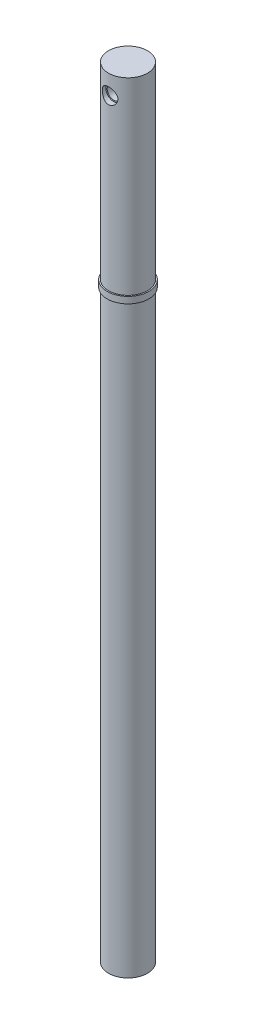
ISO-10303-21;
HEADER;
FILE_DESCRIPTION(('STEP AP214'),'2;1');
FILE_NAME('part.step','',(''),(''),'','','');
FILE_SCHEMA(('AUTOMOTIVE_DESIGN { 1 0 10303 214 1 1 1 1 }'));
ENDSEC;
DATA;
#1=APPLICATION_CONTEXT('core data for automotive mechanical design processes');
#2=APPLICATION_PROTOCOL_DEFINITION('international standard','automotive_design',2000,#1);
#3=PRODUCT_CONTEXT('',#1,'mechanical');
#4=PRODUCT('Part','Part','',(#3));
#5=PRODUCT_RELATED_PRODUCT_CATEGORY('part','',(#4));
#6=PRODUCT_DEFINITION_FORMATION('','',#4);
#7=PRODUCT_DEFINITION_CONTEXT('part definition',#1,'design');
#8=PRODUCT_DEFINITION('design','',#6,#7);
#9=PRODUCT_DEFINITION_SHAPE('','',#8);
#10=(LENGTH_UNIT() NAMED_UNIT(*) SI_UNIT(.MILLI.,.METRE.));
#11=(NAMED_UNIT(*) PLANE_ANGLE_UNIT() SI_UNIT($,.RADIAN.));
#12=(NAMED_UNIT(*) SI_UNIT($,.STERADIAN.) SOLID_ANGLE_UNIT());
#13=UNCERTAINTY_MEASURE_WITH_UNIT(LENGTH_MEASURE(1.E-05),#10,'distance_accuracy_value','');
#14=(GEOMETRIC_REPRESENTATION_CONTEXT(3) GLOBAL_UNCERTAINTY_ASSIGNED_CONTEXT((#13)) GLOBAL_UNIT_ASSIGNED_CONTEXT((#10,
#11,#12)) REPRESENTATION_CONTEXT('',''));
#15=CARTESIAN_POINT('',(0.,0.,0.));
#16=DIRECTION('',(0.,0.,1.));
#17=DIRECTION('',(1.,0.,0.));
#18=AXIS2_PLACEMENT_3D('',#15,#16,#17);
#19=CARTESIAN_POINT('',(0.,-1.5,-2.));
#20=DIRECTION('',(0.,0.,1.));
#21=DIRECTION('',(1.,0.,0.));
#22=AXIS2_PLACEMENT_3D('',#19,#20,#21);
#23=CYLINDRICAL_SURFACE('',#22,0.500000000000001);
#24=CARTESIAN_POINT('',(0.,-0.999999999999999,-1.5));
#25=CARTESIAN_POINT('',(-0.0272816814433617,-0.999999873134179,-1.50000007650472));
#26=CARTESIAN_POINT('',(-0.0545625972692751,-1.00224013306361,-1.49924884753774));
#27=CARTESIAN_POINT('',(-0.108320880436486,-1.01111455440861,-1.49632605101639));
#28=CARTESIAN_POINT('',(-0.134798164059409,-1.01774917197446,-1.49415433601069));
#29=CARTESIAN_POINT('',(-0.186166394750889,-1.03515962169203,-1.48862653953228));
#30=CARTESIAN_POINT('',(-0.211059912943019,-1.04592853122965,-1.48527243865453));
#31=CARTESIAN_POINT('',(-0.258687468402661,-1.07127058641916,-1.47772222858644));
#32=CARTESIAN_POINT('',(-0.281421078479347,-1.08584448250126,-1.47352595333789));
#33=CARTESIAN_POINT('',(-0.32487083751114,-1.11891290242942,-1.46457047221606));
#34=CARTESIAN_POINT('',(-0.34550185014918,-1.13751561713041,-1.45979778232283));
#35=CARTESIAN_POINT('',(-0.383416346351018,-1.17788357735312,-1.4503015739117));
#36=CARTESIAN_POINT('',(-0.40069909274464,-1.19964951746363,-1.44557806643816));
#37=CARTESIAN_POINT('',(-0.431912471114025,-1.24649255759887,-1.43656666240137));
#38=CARTESIAN_POINT('',(-0.445732429110874,-1.27164686986849,-1.43229519643517));
#39=CARTESIAN_POINT('',(-0.468909436938504,-1.32408804722685,-1.42487652703629));
#40=CARTESIAN_POINT('',(-0.478267848692049,-1.3513742585723,-1.4217289805919));
#41=CARTESIAN_POINT('',(-0.491936730754163,-1.40633661075025,-1.41705651655216));
#42=CARTESIAN_POINT('',(-0.496406724138348,-1.43396860426267,-1.41548047960085));
#43=CARTESIAN_POINT('',(-0.500670561669924,-1.4896318770997,-1.41397828389571));
#44=CARTESIAN_POINT('',(-0.500465850802426,-1.51766303036374,-1.41405161531));
#45=CARTESIAN_POINT('',(-0.495509951851012,-1.57196831522025,-1.41579507485375));
#46=CARTESIAN_POINT('',(-0.490966956583311,-1.59826420145904,-1.41739207928749));
#47=CARTESIAN_POINT('',(-0.477803081424897,-1.64969670980389,-1.42188328867294));
#48=CARTESIAN_POINT('',(-0.469181713295987,-1.67483319271766,-1.42477764893409));
#49=CARTESIAN_POINT('',(-0.447969529030055,-1.72370637479561,-1.43158955564248));
#50=CARTESIAN_POINT('',(-0.435317024353618,-1.74741401273473,-1.43552282896189));
#51=CARTESIAN_POINT('',(-0.406444553151584,-1.7924354541399,-1.44396279288233));
#52=CARTESIAN_POINT('',(-0.390223556182007,-1.8137485634667,-1.44846964895333));
#53=CARTESIAN_POINT('',(-0.353674666341115,-1.85454579908038,-1.45783664583764));
#54=CARTESIAN_POINT('',(-0.333176575038155,-1.87387634725453,-1.46270294677393));
#55=CARTESIAN_POINT('',(-0.289169784985033,-1.9088656333317,-1.47203469193547));
#56=CARTESIAN_POINT('',(-0.265660797830408,-1.92452401908225,-1.47650009769041));
#57=CARTESIAN_POINT('',(-0.215973806523134,-1.95184815011753,-1.48458553968889));
#58=CARTESIAN_POINT('',(-0.189771638208168,-1.96347274567037,-1.48819675004018));
#59=CARTESIAN_POINT('',(-0.135634541682254,-1.98210158697786,-1.49410283572219));
#60=CARTESIAN_POINT('',(-0.107700219077477,-1.98910743771172,-1.4963981682744));
#61=CARTESIAN_POINT('',(-0.052191914764652,-1.99802783301118,-1.4993381353572));
#62=CARTESIAN_POINT('',(-0.0246547999324228,-2.00014990458638,-1.50005000916865));
#63=CARTESIAN_POINT('',(0.0303875349801181,-1.99983366320077,-1.49994451347412));
#64=CARTESIAN_POINT('',(0.0578927596598233,-1.99739612001007,-1.49912740209676));
#65=CARTESIAN_POINT('',(0.111259933152129,-1.98819404613202,-1.49610012358557));
#66=CARTESIAN_POINT('',(0.137146403417428,-1.98155689697524,-1.49393099355614));
#67=CARTESIAN_POINT('',(0.18742797928978,-1.96430327776665,-1.48845923415017));
#68=CARTESIAN_POINT('',(0.21182289425428,-1.95368630026616,-1.48515646023271));
#69=CARTESIAN_POINT('',(0.259144148196661,-1.92846478407955,-1.47764465643714));
#70=CARTESIAN_POINT('',(0.282014979608665,-1.9137627033582,-1.47341407378153));
#71=CARTESIAN_POINT('',(0.325032415067702,-1.88090292499347,-1.46452626957872));
#72=CARTESIAN_POINT('',(0.345178183897447,-1.86274417198492,-1.45986891795944));
#73=CARTESIAN_POINT('',(0.383126253903507,-1.82251062449587,-1.45038423991236));
#74=CARTESIAN_POINT('',(0.400780484624246,-1.80029538653338,-1.44555880547578));
#75=CARTESIAN_POINT('',(0.432128761160427,-1.75311421609775,-1.43649986643491));
#76=CARTESIAN_POINT('',(0.445822773960422,-1.7281482606949,-1.4322663667656));
#77=CARTESIAN_POINT('',(0.468798465211681,-1.6761634923467,-1.42491195910154));
#78=CARTESIAN_POINT('',(0.478089066098884,-1.64914896037861,-1.42178880450316));
#79=CARTESIAN_POINT('',(0.491947333396082,-1.59381067493793,-1.41705416199567));
#80=CARTESIAN_POINT('',(0.496517127480622,-1.56548751728347,-1.41544199311349));
#81=CARTESIAN_POINT('',(0.50063814123519,-1.50990145199339,-1.41398929437536));
#82=CARTESIAN_POINT('',(0.500435128655464,-1.48265882987413,-1.4140620017215));
#83=CARTESIAN_POINT('',(0.49562114672744,-1.42861746255013,-1.4157563496178));
#84=CARTESIAN_POINT('',(0.491010439729444,-1.40181869102354,-1.41737789797942));
#85=CARTESIAN_POINT('',(0.477685906563491,-1.34993216849367,-1.42192262139472));
#86=CARTESIAN_POINT('',(0.469051673007441,-1.32482158749638,-1.42482049007757));
#87=CARTESIAN_POINT('',(0.447989682880192,-1.27638629653223,-1.43158199412717));
#88=CARTESIAN_POINT('',(0.43556108427699,-1.25306198440637,-1.43544584382648));
#89=CARTESIAN_POINT('',(0.406630346291625,-1.20775816503815,-1.4439141461203));
#90=CARTESIAN_POINT('',(0.389974121382267,-1.1858817490507,-1.44854355820802));
#91=CARTESIAN_POINT('',(0.353321441567849,-1.145155093308,-1.45791678141893));
#92=CARTESIAN_POINT('',(0.333324042225748,-1.12630571215599,-1.46266062456259));
#93=CARTESIAN_POINT('',(0.289620778460338,-1.09142779385538,-1.47195015262697));
#94=CARTESIAN_POINT('',(0.265800756749863,-1.07553782612449,-1.47648090900608));
#95=CARTESIAN_POINT('',(0.215678678703315,-1.04800478557468,-1.48462995586326));
#96=CARTESIAN_POINT('',(0.189377259066175,-1.03636062703898,-1.4882484795397));
#97=CARTESIAN_POINT('',(0.136246823600488,-1.01813918375566,-1.49402757534266));
#98=CARTESIAN_POINT('',(0.109493878838205,-1.01135876686831,-1.4962460621126));
#99=CARTESIAN_POINT('',(0.055160208005124,-1.00228985966144,-1.49923203532112));
#100=CARTESIAN_POINT('',(0.0275797127843734,-1.00000012825173,-1.49999992265952));
#101=CARTESIAN_POINT('',(0.,-0.999999999999999,-1.5));
#102=B_SPLINE_CURVE_WITH_KNOTS('',3,(#24,#25,#26,#27,#28,#29,#30,#31,#32,#33,#34,#35,#36,#37,
#38,#39,#40,#41,#42,#43,#44,#45,#46,#47,#48,#49,#50,#51,#52,#53,#54,#55,#56,#57,#58,#59,#60,#61,
#62,#63,#64,#65,#66,#67,#68,#69,#70,#71,#72,#73,#74,#75,#76,#77,#78,#79,#80,#81,#82,#83,#84,#85,
#86,#87,#88,#89,#90,#91,#92,#93,#94,#95,#96,#97,#98,#99,#100,#101),.UNSPECIFIED.,.T.,.F.,(4,2,2,
2,2,2,2,2,2,2,2,2,2,2,2,2,2,2,2,2,2,2,2,2,2,2,2,2,2,2,2,2,2,2,2,2,2,2,4),(0.,0.0817435530130056,
0.163495592633761,0.245111336435137,0.326743188899551,0.410923421413781,0.495122166437652,
0.581741924117353,0.668335223464168,0.752009628687922,0.83565816989418,0.915484132713154,
0.995319654234163,1.07644085573241,1.15758551274779,1.24296652901359,1.32835572978985,
1.41459202820854,1.5007983443428,1.5832679158326,1.66572356577764,1.74579078984782,
1.82586822637727,1.90805199917544,1.99026090406621,2.07620511436051,2.16215004113174,
2.24792006907884,2.33365142346098,2.41497833023985,2.49630039666268,2.57607793530789,
2.65587319078569,2.73915033336483,2.8224510555247,2.90899830408131,2.99552340566809,
3.07818279177487,3.16081933009651),.UNSPECIFIED.);
#103=CARTESIAN_POINT('',(0.,-0.999999999999999,-1.5));
#104=VERTEX_POINT('',#103);
#105=EDGE_CURVE('E54',#104,#104,#102,.T.);
#106=ORIENTED_EDGE('',*,*,#105,.F.);
#107=EDGE_LOOP('',(#106));
#108=FACE_BOUND('',#107,.T.);
#109=CARTESIAN_POINT('',(0.,-1.5,1.1));
#110=DIRECTION('',(0.,0.,1.));
#111=DIRECTION('',(1.,0.,0.));
#112=AXIS2_PLACEMENT_3D('',#109,#110,#111);
#113=CIRCLE('',#112,0.500000000000001);
#114=CARTESIAN_POINT('',(0.500000000000001,-1.5,1.1));
#115=VERTEX_POINT('',#114);
#116=EDGE_CURVE('E55',#115,#115,#113,.F.);
#117=ORIENTED_EDGE('',*,*,#116,.F.);
#118=EDGE_LOOP('',(#117));
#119=FACE_BOUND('',#118,.T.);
#120=ADVANCED_FACE('F31',(#108,#119),#23,.F.);
#121=CARTESIAN_POINT('',(0.,0.,0.));
#122=DIRECTION('',(0.,1.,0.));
#123=DIRECTION('',(0.,0.,1.));
#124=AXIS2_PLACEMENT_3D('',#121,#122,#123);
#125=PLANE('',#124);
#126=CARTESIAN_POINT('',(0.,0.,0.));
#127=DIRECTION('',(0.,1.,0.));
#128=DIRECTION('',(0.,0.,1.));
#129=AXIS2_PLACEMENT_3D('',#126,#127,#128);
#130=CIRCLE('',#129,1.5);
#131=CARTESIAN_POINT('',(0.,0.,1.5));
#132=VERTEX_POINT('',#131);
#133=EDGE_CURVE('E43',#132,#132,#130,.T.);
#134=ORIENTED_EDGE('',*,*,#133,.T.);
#135=EDGE_LOOP('',(#134));
#136=FACE_BOUND('',#135,.T.);
#137=ADVANCED_FACE('F33',(#136),#125,.T.);
#138=CARTESIAN_POINT('',(0.,0.,0.));
#139=DIRECTION('',(0.,-1.,0.));
#140=DIRECTION('',(0.,0.,-1.));
#141=AXIS2_PLACEMENT_3D('',#138,#139,#140);
#142=CYLINDRICAL_SURFACE('',#141,1.5);
#143=CARTESIAN_POINT('',(0.,-14.5,0.));
#144=DIRECTION('',(0.,1.,0.));
#145=DIRECTION('',(0.,0.,1.));
#146=AXIS2_PLACEMENT_3D('',#143,#144,#145);
#147=CIRCLE('',#146,1.5);
#148=CARTESIAN_POINT('',(0.,-14.5,1.5));
#149=VERTEX_POINT('',#148);
#150=EDGE_CURVE('E35',#149,#149,#147,.T.);
#151=ORIENTED_EDGE('',*,*,#150,.T.);
#152=EDGE_LOOP('',(#151));
#153=FACE_BOUND('',#152,.T.);
#154=CARTESIAN_POINT('',(0.600000000000001,-1.5,1.37477270848675));
#155=CARTESIAN_POINT('',(0.599996476261137,-1.53214184942997,1.37477595496926));
#156=CARTESIAN_POINT('',(0.597401945578307,-1.56432916041141,1.3759158074528));
#157=CARTESIAN_POINT('',(0.58712070917782,-1.62778044986312,1.38033274256353));
#158=CARTESIAN_POINT('',(0.57942099133264,-1.65904185512415,1.38361528616055));
#159=CARTESIAN_POINT('',(0.559270509770612,-1.71961588259102,1.39188136737389));
#160=CARTESIAN_POINT('',(0.546837645757628,-1.74893536420808,1.39685848907134));
#161=CARTESIAN_POINT('',(0.517626080811484,-1.80506551525789,1.40794399528584));
#162=CARTESIAN_POINT('',(0.50084832878025,-1.83187673074526,1.41405213271177));
#163=CARTESIAN_POINT('',(0.462396592376227,-1.88377812067244,1.4271025951531));
#164=CARTESIAN_POINT('',(0.440513807318199,-1.90870692687884,1.43407175387624));
#165=CARTESIAN_POINT('',(0.392912731732214,-1.95465869919461,1.44783737093643));
#166=CARTESIAN_POINT('',(0.367193106502705,-1.97568030038696,1.45463376820912));
#167=CARTESIAN_POINT('',(0.311401893106914,-2.01402191909481,1.46761022372056));
#168=CARTESIAN_POINT('',(0.281198689683685,-2.03116329044119,1.4737554110507));
#169=CARTESIAN_POINT('',(0.218047596862537,-2.06005307051694,1.48441178289464));
#170=CARTESIAN_POINT('',(0.185100830786389,-2.07180367373459,1.48892363215402));
#171=CARTESIAN_POINT('',(0.119089928051668,-2.08900244593122,1.49561497502485));
#172=CARTESIAN_POINT('',(0.086108695441382,-2.09472819422671,1.49789681032607));
#173=CARTESIAN_POINT('',(0.0195798985912956,-2.10060854569881,1.50024093204811));
#174=CARTESIAN_POINT('',(-0.0139674497476207,-2.10076522678045,1.50030404630794));
#175=CARTESIAN_POINT('',(-0.0786697484145935,-2.09565516906751,1.49826588846536));
#176=CARTESIAN_POINT('',(-0.10985323586221,-2.09069256817592,1.49628599031551));
#177=CARTESIAN_POINT('',(-0.170901932765501,-2.07600213710677,1.49054787440637));
#178=CARTESIAN_POINT('',(-0.200767045317048,-2.06627395727988,1.48678952616334));
#179=CARTESIAN_POINT('',(-0.258869381553497,-2.04220905513711,1.4777904733731));
#180=CARTESIAN_POINT('',(-0.28707528701389,-2.02780508555534,1.4725282814004));
#181=CARTESIAN_POINT('',(-0.340742445222173,-1.9948604979243,1.46104375553909));
#182=CARTESIAN_POINT('',(-0.366202752814833,-1.97631846207071,1.45482109279522));
#183=CARTESIAN_POINT('',(-0.415430648397646,-1.93420525921602,1.441564911535));
#184=CARTESIAN_POINT('',(-0.438977353582093,-1.91038383222485,1.43450497956072));
#185=CARTESIAN_POINT('',(-0.481832224615598,-1.85910282845371,1.42068498289434));
#186=CARTESIAN_POINT('',(-0.501139003127898,-1.83164206555375,1.41392501692904));
#187=CARTESIAN_POINT('',(-0.53547125662288,-1.77287429327731,1.40129069232544));
#188=CARTESIAN_POINT('',(-0.550360395520472,-1.74148055085485,1.39544674254414));
#189=CARTESIAN_POINT('',(-0.574552877989881,-1.6763353528614,1.38566277140197));
#190=CARTESIAN_POINT('',(-0.58385984952132,-1.64258544456875,1.38172151377002));
#191=CARTESIAN_POINT('',(-0.596086484649588,-1.57588926676919,1.37648927901769));
#192=CARTESIAN_POINT('',(-0.599361629042524,-1.54301986586395,1.37505109934423));
#193=CARTESIAN_POINT('',(-0.600468397934706,-1.47717683766962,1.37456849363129));
#194=CARTESIAN_POINT('',(-0.598301673177866,-1.44420324501665,1.37552334168739));
#195=CARTESIAN_POINT('',(-0.588909868436558,-1.38106231951354,1.3795681330714));
#196=CARTESIAN_POINT('',(-0.581979918607038,-1.35084211878015,1.38253337339331));
#197=CARTESIAN_POINT('',(-0.563641256073384,-1.2920134785642,1.39011015308361));
#198=CARTESIAN_POINT('',(-0.552231550290718,-1.26340539806781,1.39472205746623));
#199=CARTESIAN_POINT('',(-0.524740691844437,-1.20731929266135,1.40530134557985));
#200=CARTESIAN_POINT('',(-0.508488860479379,-1.17993414339166,1.4113161139174));
#201=CARTESIAN_POINT('',(-0.471949567332563,-1.1281551037675,1.42395115547351));
#202=CARTESIAN_POINT('',(-0.451660462044596,-1.10376243816132,1.43057167468819));
#203=CARTESIAN_POINT('',(-0.405853263504146,-1.05678797742024,1.44426274791419));
#204=CARTESIAN_POINT('',(-0.38005962883353,-1.03447303041269,1.45133042185561));
#205=CARTESIAN_POINT('',(-0.324925090010654,-0.994446877016898,1.46465938370269));
#206=CARTESIAN_POINT('',(-0.29558404154036,-0.97673585802083,1.47092063877972));
#207=CARTESIAN_POINT('',(-0.234083980200529,-0.946485712061632,1.48195114770086));
#208=CARTESIAN_POINT('',(-0.20192564429822,-0.933945346750264,1.48672075872082));
#209=CARTESIAN_POINT('',(-0.135718077275768,-0.91453534427771,1.49421814040787));
#210=CARTESIAN_POINT('',(-0.101669883088281,-0.907662629567979,1.49694701912263));
#211=CARTESIAN_POINT('',(-0.0350449531038913,-0.900148589512384,1.49993702463154));
#212=CARTESIAN_POINT('',(-0.00251714777791697,-0.899129961461204,1.50034754023462));
#213=CARTESIAN_POINT('',(0.0622301507199728,-0.902356643785231,1.49905812713578));
#214=CARTESIAN_POINT('',(0.0944496898183864,-0.906601157335685,1.49735851790074));
#215=CARTESIAN_POINT('',(0.156651270583923,-0.919964036507543,1.49211454009276));
#216=CARTESIAN_POINT('',(0.186671641394516,-0.928928683822666,1.48862844190299));
#217=CARTESIAN_POINT('',(0.244776706427682,-0.951315841368546,1.48018484349611));
#218=CARTESIAN_POINT('',(0.272861042480183,-0.964739173806103,1.47522707191203));
#219=CARTESIAN_POINT('',(0.327660912556835,-0.996330959546802,1.46405428308017));
#220=CARTESIAN_POINT('',(0.354261116041928,-1.01468288846552,1.45779338918469));
#221=CARTESIAN_POINT('',(0.404116208557222,-1.05533655575368,1.44476820955934));
#222=CARTESIAN_POINT('',(0.427369705723727,-1.07763992893803,1.4380037161515));
#223=CARTESIAN_POINT('',(0.471360379525798,-1.12719456735751,1.42421329067827));
#224=CARTESIAN_POINT('',(0.491852666159709,-1.15466666202033,1.41719709781615));
#225=CARTESIAN_POINT('',(0.52795423513182,-1.21288264122863,1.40414901442554));
#226=CARTESIAN_POINT('',(0.543562943369997,-1.24362690987296,1.39811723966237));
#227=CARTESIAN_POINT('',(0.568197326301993,-1.30471116055442,1.38827659337372));
#228=CARTESIAN_POINT('',(0.577688254249263,-1.33483957042535,1.38431675583494));
#229=CARTESIAN_POINT('',(0.591815327345516,-1.3963456258891,1.37833801081189));
#230=CARTESIAN_POINT('',(0.596465000366405,-1.42771953479009,1.37631369621653));
#231=CARTESIAN_POINT('',(0.599539277493053,-1.47281326870138,1.3749733762729));
#232=CARTESIAN_POINT('',(0.600001490698465,-1.48640256629928,1.37477133508007));
#233=CARTESIAN_POINT('',(0.600000000000001,-1.5,1.37477270848675));
#234=B_SPLINE_CURVE_WITH_KNOTS('',3,(#154,#155,#156,#157,#158,#159,#160,#161,#162,#163,#164,
#165,#166,#167,#168,#169,#170,#171,#172,#173,#174,#175,#176,#177,#178,#179,#180,#181,#182,#183,
#184,#185,#186,#187,#188,#189,#190,#191,#192,#193,#194,#195,#196,#197,#198,#199,#200,#201,#202,
#203,#204,#205,#206,#207,#208,#209,#210,#211,#212,#213,#214,#215,#216,#217,#218,#219,#220,#221,
#222,#223,#224,#225,#226,#227,#228,#229,#230,#231,#232,#233),.UNSPECIFIED.,.T.,.F.,(4,2,2,2,2,2,
2,2,2,2,2,2,2,2,2,2,2,2,2,2,2,2,2,2,2,2,2,2,2,2,2,2,2,2,2,2,2,2,2,4),(0.,0.0963832946302963,
0.193013200746674,0.289281246988018,0.385528286471585,0.486766854853275,0.588040723045027,
0.693308007274286,0.798532400908442,0.898662548661552,0.998755335917017,1.09322593449091,
1.18770346538718,1.2836049007047,1.3795392448201,1.48177213224407,1.58403842138138,
1.68919337614373,1.79427991438234,1.89294644255529,1.99158304470585,2.08460174423747,
2.17764107593695,2.27445346394014,2.37130534355958,2.47531120272297,2.57932129454028,
2.68330646192047,2.78723512784444,2.88438311924989,2.98151640451984,3.07566598331209,
3.16983293346779,3.26816115340181,3.36653014967465,3.47098875983887,3.5754596452596,
3.67054998243926,3.76537389063977,3.80614831656221),.UNSPECIFIED.);
#235=CARTESIAN_POINT('',(0.600000000000001,-1.5,1.37477270848675));
#236=VERTEX_POINT('',#235);
#237=EDGE_CURVE('E46',#236,#236,#234,.T.);
#238=ORIENTED_EDGE('',*,*,#237,.T.);
#239=EDGE_LOOP('',(#238));
#240=FACE_BOUND('',#239,.T.);
#241=ORIENTED_EDGE('',*,*,#105,.T.);
#242=EDGE_LOOP('',(#241));
#243=FACE_BOUND('',#242,.T.);
#244=ORIENTED_EDGE('',*,*,#133,.F.);
#245=EDGE_LOOP('',(#244));
#246=FACE_BOUND('',#245,.T.);
#247=ADVANCED_FACE('F57',(#153,#240,#243,#246),#142,.T.);
#248=CARTESIAN_POINT('',(0.,-1.5,1.1));
#249=DIRECTION('',(0.,0.,1.));
#250=DIRECTION('',(1.,0.,0.));
#251=AXIS2_PLACEMENT_3D('',#248,#249,#250);
#252=CYLINDRICAL_SURFACE('',#251,0.600000000000001);
#253=CARTESIAN_POINT('',(0.,-1.5,1.1));
#254=DIRECTION('',(0.,0.,1.));
#255=DIRECTION('',(1.,0.,0.));
#256=AXIS2_PLACEMENT_3D('',#253,#254,#255);
#257=CIRCLE('',#256,0.600000000000001);
#258=CARTESIAN_POINT('',(0.600000000000001,-1.5,1.1));
#259=VERTEX_POINT('',#258);
#260=EDGE_CURVE('E77',#259,#259,#257,.T.);
#261=ORIENTED_EDGE('',*,*,#260,.F.);
#262=EDGE_LOOP('',(#261));
#263=FACE_BOUND('',#262,.T.);
#264=ORIENTED_EDGE('',*,*,#237,.F.);
#265=EDGE_LOOP('',(#264));
#266=FACE_BOUND('',#265,.T.);
#267=ADVANCED_FACE('F60',(#263,#266),#252,.F.);
#268=CARTESIAN_POINT('',(0.,-1.5,1.1));
#269=DIRECTION('',(0.,0.,1.));
#270=DIRECTION('',(1.,0.,0.));
#271=AXIS2_PLACEMENT_3D('',#268,#269,#270);
#272=PLANE('',#271);
#273=ORIENTED_EDGE('',*,*,#260,.T.);
#274=EDGE_LOOP('',(#273));
#275=FACE_BOUND('',#274,.T.);
#276=ORIENTED_EDGE('',*,*,#116,.T.);
#277=EDGE_LOOP('',(#276));
#278=FACE_BOUND('',#277,.T.);
#279=ADVANCED_FACE('F64',(#275,#278),#272,.T.);
#280=CARTESIAN_POINT('',(0.,-14.5,0.));
#281=DIRECTION('',(0.,-1.,0.));
#282=DIRECTION('',(0.,0.,-1.));
#283=AXIS2_PLACEMENT_3D('',#280,#281,#282);
#284=CYLINDRICAL_SURFACE('',#283,1.6);
#285=CARTESIAN_POINT('',(0.,-14.5,0.));
#286=DIRECTION('',(0.,1.,0.));
#287=DIRECTION('',(0.,0.,1.));
#288=AXIS2_PLACEMENT_3D('',#285,#286,#287);
#289=CIRCLE('',#288,1.6);
#290=CARTESIAN_POINT('',(0.,-14.5,1.6));
#291=VERTEX_POINT('',#290);
#292=EDGE_CURVE('E83',#291,#291,#289,.T.);
#293=ORIENTED_EDGE('',*,*,#292,.F.);
#294=EDGE_LOOP('',(#293));
#295=FACE_BOUND('',#294,.T.);
#296=CARTESIAN_POINT('',(0.,-15.,0.));
#297=DIRECTION('',(0.,1.,0.));
#298=DIRECTION('',(0.,0.,1.));
#299=AXIS2_PLACEMENT_3D('',#296,#297,#298);
#300=CIRCLE('',#299,1.6);
#301=CARTESIAN_POINT('',(0.,-15.,1.6));
#302=VERTEX_POINT('',#301);
#303=EDGE_CURVE('E80',#302,#302,#300,.T.);
#304=ORIENTED_EDGE('',*,*,#303,.T.);
#305=EDGE_LOOP('',(#304));
#306=FACE_BOUND('',#305,.T.);
#307=ADVANCED_FACE('F95',(#295,#306),#284,.T.);
#308=CARTESIAN_POINT('',(0.,-14.5,0.));
#309=DIRECTION('',(0.,1.,0.));
#310=DIRECTION('',(0.,0.,1.));
#311=AXIS2_PLACEMENT_3D('',#308,#309,#310);
#312=PLANE('',#311);
#313=ORIENTED_EDGE('',*,*,#150,.F.);
#314=EDGE_LOOP('',(#313));
#315=FACE_BOUND('',#314,.T.);
#316=ORIENTED_EDGE('',*,*,#292,.T.);
#317=EDGE_LOOP('',(#316));
#318=FACE_BOUND('',#317,.T.);
#319=ADVANCED_FACE('F92',(#315,#318),#312,.T.);
#320=CARTESIAN_POINT('',(0.,-15.,0.));
#321=DIRECTION('',(0.,1.,0.));
#322=DIRECTION('',(0.,0.,1.));
#323=AXIS2_PLACEMENT_3D('',#320,#321,#322);
#324=PLANE('',#323);
#325=CARTESIAN_POINT('',(0.,-15.,0.));
#326=DIRECTION('',(0.,1.,0.));
#327=DIRECTION('',(0.,0.,1.));
#328=AXIS2_PLACEMENT_3D('',#325,#326,#327);
#329=CIRCLE('',#328,1.5);
#330=CARTESIAN_POINT('',(0.,-15.,1.5));
#331=VERTEX_POINT('',#330);
#332=EDGE_CURVE('E10',#331,#331,#329,.T.);
#333=ORIENTED_EDGE('',*,*,#332,.T.);
#334=EDGE_LOOP('',(#333));
#335=FACE_BOUND('',#334,.T.);
#336=ORIENTED_EDGE('',*,*,#303,.F.);
#337=EDGE_LOOP('',(#336));
#338=FACE_BOUND('',#337,.T.);
#339=ADVANCED_FACE('F94',(#335,#338),#324,.F.);
#340=CARTESIAN_POINT('',(0.,-60.,0.));
#341=DIRECTION('',(0.,1.,0.));
#342=DIRECTION('',(0.,0.,1.));
#343=AXIS2_PLACEMENT_3D('',#340,#341,#342);
#344=PLANE('',#343);
#345=CARTESIAN_POINT('',(0.,-60.,0.));
#346=DIRECTION('',(0.,1.,0.));
#347=DIRECTION('',(0.,0.,1.));
#348=AXIS2_PLACEMENT_3D('',#345,#346,#347);
#349=CIRCLE('',#348,1.5);
#350=CARTESIAN_POINT('',(0.,-60.,1.49999999999999));
#351=VERTEX_POINT('',#350);
#352=EDGE_CURVE('E39',#351,#351,#349,.T.);
#353=ORIENTED_EDGE('',*,*,#352,.F.);
#354=EDGE_LOOP('',(#353));
#355=FACE_BOUND('',#354,.T.);
#356=ADVANCED_FACE('F101',(#355),#344,.F.);
#357=ORIENTED_EDGE('',*,*,#352,.T.);
#358=EDGE_LOOP('',(#357));
#359=FACE_BOUND('',#358,.T.);
#360=ORIENTED_EDGE('',*,*,#332,.F.);
#361=EDGE_LOOP('',(#360));
#362=FACE_BOUND('',#361,.T.);
#363=ADVANCED_FACE('F123',(#359,#362),#142,.T.);
#364=CLOSED_SHELL('',(#120,#137,#247,#267,#279,#307,#319,#339,#356,#363));
#365=MANIFOLD_SOLID_BREP('B2',#364);
#366=ADVANCED_BREP_SHAPE_REPRESENTATION('',(#18,#365),#14);
#367=SHAPE_DEFINITION_REPRESENTATION(#9,#366);
ENDSEC;
END-ISO-10303-21;
